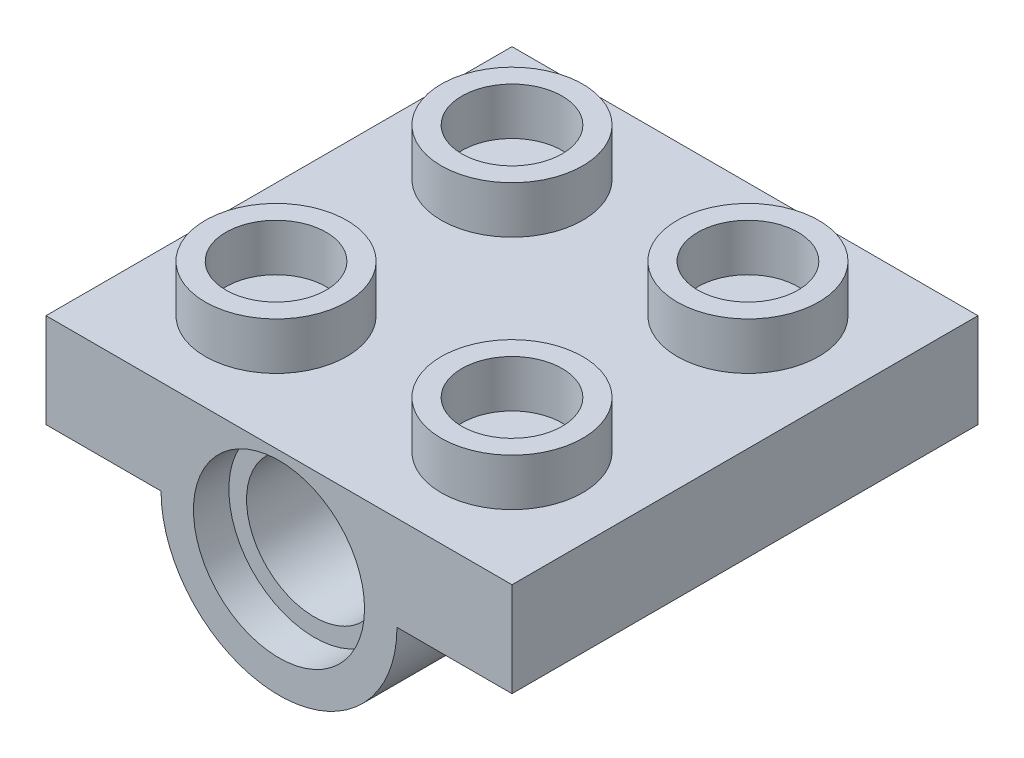
ISO-10303-21;
HEADER;
FILE_DESCRIPTION(('STEP AP214'),'2;1');
FILE_NAME('part.step','',(''),(''),'','','');
FILE_SCHEMA(('AUTOMOTIVE_DESIGN { 1 0 10303 214 1 1 1 1 }'));
ENDSEC;
DATA;
#1=APPLICATION_CONTEXT('core data for automotive mechanical design processes');
#2=APPLICATION_PROTOCOL_DEFINITION('international standard','automotive_design',2000,#1);
#3=PRODUCT_CONTEXT('',#1,'mechanical');
#4=PRODUCT('Part','Part','',(#3));
#5=PRODUCT_RELATED_PRODUCT_CATEGORY('part','',(#4));
#6=PRODUCT_DEFINITION_FORMATION('','',#4);
#7=PRODUCT_DEFINITION_CONTEXT('part definition',#1,'design');
#8=PRODUCT_DEFINITION('design','',#6,#7);
#9=PRODUCT_DEFINITION_SHAPE('','',#8);
#10=(LENGTH_UNIT() NAMED_UNIT(*) SI_UNIT(.MILLI.,.METRE.));
#11=(NAMED_UNIT(*) PLANE_ANGLE_UNIT() SI_UNIT($,.RADIAN.));
#12=(NAMED_UNIT(*) SI_UNIT($,.STERADIAN.) SOLID_ANGLE_UNIT());
#13=UNCERTAINTY_MEASURE_WITH_UNIT(LENGTH_MEASURE(1.E-05),#10,'distance_accuracy_value','');
#14=(GEOMETRIC_REPRESENTATION_CONTEXT(3) GLOBAL_UNCERTAINTY_ASSIGNED_CONTEXT((#13)) GLOBAL_UNIT_ASSIGNED_CONTEXT((#10,
#11,#12)) REPRESENTATION_CONTEXT('',''));
#15=CARTESIAN_POINT('',(0.,0.,0.));
#16=DIRECTION('',(0.,0.,1.));
#17=DIRECTION('',(1.,0.,0.));
#18=AXIS2_PLACEMENT_3D('',#15,#16,#17);
#19=CARTESIAN_POINT('',(0.,0.,-15.8));
#20=DIRECTION('',(0.,-1.,0.));
#21=DIRECTION('',(0.,0.,-1.));
#22=AXIS2_PLACEMENT_3D('',#19,#20,#21);
#23=PLANE('',#22);
#24=DIRECTION('',(1.,0.,0.));
#25=VECTOR('',#24,1.);
#26=CARTESIAN_POINT('',(14.6,0.,-14.6));
#27=LINE('',#26,#25);
#28=CARTESIAN_POINT('',(11.9,0.,-14.6));
#29=VERTEX_POINT('',#28);
#30=CARTESIAN_POINT('',(14.6,0.,-14.6));
#31=VERTEX_POINT('',#30);
#32=EDGE_CURVE('E278',#29,#31,#27,.T.);
#33=ORIENTED_EDGE('',*,*,#32,.F.);
#34=DIRECTION('',(0.,0.,-1.));
#35=VECTOR('',#34,1.);
#36=CARTESIAN_POINT('',(11.9,0.,-8.9));
#37=LINE('',#36,#35);
#38=CARTESIAN_POINT('',(11.9,0.,-15.8));
#39=VERTEX_POINT('',#38);
#40=EDGE_CURVE('E60',#29,#39,#37,.T.);
#41=ORIENTED_EDGE('',*,*,#40,.T.);
#42=DIRECTION('',(1.,0.,0.));
#43=VECTOR('',#42,1.);
#44=CARTESIAN_POINT('',(0.,0.,-15.8));
#45=LINE('',#44,#43);
#46=CARTESIAN_POINT('',(15.8,0.,-15.8));
#47=VERTEX_POINT('',#46);
#48=EDGE_CURVE('E382',#39,#47,#45,.T.);
#49=ORIENTED_EDGE('',*,*,#48,.T.);
#50=DIRECTION('',(0.,0.,1.));
#51=VECTOR('',#50,1.);
#52=CARTESIAN_POINT('',(15.8,0.,-15.8));
#53=LINE('',#52,#51);
#54=CARTESIAN_POINT('',(15.8,0.,0.));
#55=VERTEX_POINT('',#54);
#56=EDGE_CURVE('E416',#47,#55,#53,.T.);
#57=ORIENTED_EDGE('',*,*,#56,.T.);
#58=DIRECTION('',(1.,0.,0.));
#59=VECTOR('',#58,1.);
#60=CARTESIAN_POINT('',(0.,0.,0.));
#61=LINE('',#60,#59);
#62=CARTESIAN_POINT('',(11.9,0.,0.));
#63=VERTEX_POINT('',#62);
#64=EDGE_CURVE('E397',#63,#55,#61,.T.);
#65=ORIENTED_EDGE('',*,*,#64,.F.);
#66=DIRECTION('',(0.,0.,1.));
#67=VECTOR('',#66,1.);
#68=CARTESIAN_POINT('',(11.9,0.,-6.9));
#69=LINE('',#68,#67);
#70=CARTESIAN_POINT('',(11.9,0.,-1.2));
#71=VERTEX_POINT('',#70);
#72=EDGE_CURVE('E243',#71,#63,#69,.T.);
#73=ORIENTED_EDGE('',*,*,#72,.F.);
#74=DIRECTION('',(-1.,0.,0.));
#75=VECTOR('',#74,1.);
#76=CARTESIAN_POINT('',(1.2,0.,-1.2));
#77=LINE('',#76,#75);
#78=CARTESIAN_POINT('',(14.6,0.,-1.2));
#79=VERTEX_POINT('',#78);
#80=EDGE_CURVE('E265',#79,#71,#77,.T.);
#81=ORIENTED_EDGE('',*,*,#80,.F.);
#82=DIRECTION('',(0.,0.,1.));
#83=VECTOR('',#82,1.);
#84=CARTESIAN_POINT('',(14.6,0.,-1.2));
#85=LINE('',#84,#83);
#86=EDGE_CURVE('E271',#31,#79,#85,.T.);
#87=ORIENTED_EDGE('',*,*,#86,.F.);
#88=EDGE_LOOP('',(#33,#41,#49,#57,#65,#73,#81,#87));
#89=FACE_BOUND('',#88,.T.);
#90=ADVANCED_FACE('F43',(#89),#23,.T.);
#91=CARTESIAN_POINT('',(0.,0.,-15.8));
#92=VERTEX_POINT('',#91);
#93=CARTESIAN_POINT('',(3.9,0.,-15.8));
#94=VERTEX_POINT('',#93);
#95=EDGE_CURVE('E68',#92,#94,#45,.T.);
#96=ORIENTED_EDGE('',*,*,#95,.T.);
#97=DIRECTION('',(0.,0.,-1.));
#98=VECTOR('',#97,1.);
#99=CARTESIAN_POINT('',(3.9,0.,-8.9));
#100=LINE('',#99,#98);
#101=CARTESIAN_POINT('',(3.9,0.,-14.6));
#102=VERTEX_POINT('',#101);
#103=EDGE_CURVE('E191',#102,#94,#100,.T.);
#104=ORIENTED_EDGE('',*,*,#103,.F.);
#105=CARTESIAN_POINT('',(1.2,0.,-14.6));
#106=VERTEX_POINT('',#105);
#107=EDGE_CURVE('E275',#106,#102,#27,.T.);
#108=ORIENTED_EDGE('',*,*,#107,.F.);
#109=DIRECTION('',(0.,0.,-1.));
#110=VECTOR('',#109,1.);
#111=CARTESIAN_POINT('',(1.2,0.,-14.6));
#112=LINE('',#111,#110);
#113=CARTESIAN_POINT('',(1.2,0.,-1.2));
#114=VERTEX_POINT('',#113);
#115=EDGE_CURVE('E264',#114,#106,#112,.T.);
#116=ORIENTED_EDGE('',*,*,#115,.F.);
#117=CARTESIAN_POINT('',(3.9,0.,-1.2));
#118=VERTEX_POINT('',#117);
#119=EDGE_CURVE('E270',#118,#114,#77,.T.);
#120=ORIENTED_EDGE('',*,*,#119,.F.);
#121=DIRECTION('',(0.,0.,1.));
#122=VECTOR('',#121,1.);
#123=CARTESIAN_POINT('',(3.9,0.,-6.9));
#124=LINE('',#123,#122);
#125=CARTESIAN_POINT('',(3.9,0.,0.));
#126=VERTEX_POINT('',#125);
#127=EDGE_CURVE('E252',#118,#126,#124,.T.);
#128=ORIENTED_EDGE('',*,*,#127,.T.);
#129=CARTESIAN_POINT('',(0.,0.,0.));
#130=VERTEX_POINT('',#129);
#131=EDGE_CURVE('E398',#130,#126,#61,.T.);
#132=ORIENTED_EDGE('',*,*,#131,.F.);
#133=DIRECTION('',(0.,0.,1.));
#134=VECTOR('',#133,1.);
#135=CARTESIAN_POINT('',(0.,0.,-15.8));
#136=LINE('',#135,#134);
#137=EDGE_CURVE('E393',#92,#130,#136,.T.);
#138=ORIENTED_EDGE('',*,*,#137,.F.);
#139=EDGE_LOOP('',(#96,#104,#108,#116,#120,#128,#132,#138));
#140=FACE_BOUND('',#139,.T.);
#141=ADVANCED_FACE('F484',(#140),#23,.T.);
#142=CARTESIAN_POINT('',(0.,3.,-15.8));
#143=DIRECTION('',(0.,1.,0.));
#144=DIRECTION('',(0.,0.,1.));
#145=AXIS2_PLACEMENT_3D('',#142,#143,#144);
#146=PLANE('',#145);
#147=DIRECTION('',(0.,0.,1.));
#148=VECTOR('',#147,1.);
#149=CARTESIAN_POINT('',(11.9,3.,-15.8));
#150=LINE('',#149,#148);
#151=CARTESIAN_POINT('',(11.9,3.,-14.6));
#152=VERTEX_POINT('',#151);
#153=CARTESIAN_POINT('',(11.9,3.,-8.9));
#154=VERTEX_POINT('',#153);
#155=EDGE_CURVE('E214',#152,#154,#150,.T.);
#156=ORIENTED_EDGE('',*,*,#155,.F.);
#157=DIRECTION('',(1.,0.,0.));
#158=VECTOR('',#157,1.);
#159=CARTESIAN_POINT('',(14.6,3.,-14.6));
#160=LINE('',#159,#158);
#161=CARTESIAN_POINT('',(14.6,3.,-14.6));
#162=VERTEX_POINT('',#161);
#163=EDGE_CURVE('E269',#152,#162,#160,.T.);
#164=ORIENTED_EDGE('',*,*,#163,.T.);
#165=DIRECTION('',(0.,0.,1.));
#166=VECTOR('',#165,1.);
#167=CARTESIAN_POINT('',(14.6,3.,-1.2));
#168=LINE('',#167,#166);
#169=CARTESIAN_POINT('',(14.6,3.,-1.2));
#170=VERTEX_POINT('',#169);
#171=EDGE_CURVE('E298',#162,#170,#168,.T.);
#172=ORIENTED_EDGE('',*,*,#171,.T.);
#173=DIRECTION('',(-1.,0.,0.));
#174=VECTOR('',#173,1.);
#175=CARTESIAN_POINT('',(1.2,3.,-1.2));
#176=LINE('',#175,#174);
#177=CARTESIAN_POINT('',(11.9,3.,-1.2));
#178=VERTEX_POINT('',#177);
#179=EDGE_CURVE('E293',#170,#178,#176,.T.);
#180=ORIENTED_EDGE('',*,*,#179,.T.);
#181=DIRECTION('',(0.,0.,-1.));
#182=VECTOR('',#181,1.);
#183=CARTESIAN_POINT('',(11.9,3.,-15.8));
#184=LINE('',#183,#182);
#185=CARTESIAN_POINT('',(11.9,3.,-6.9));
#186=VERTEX_POINT('',#185);
#187=EDGE_CURVE('E251',#178,#186,#184,.T.);
#188=ORIENTED_EDGE('',*,*,#187,.T.);
#189=DIRECTION('',(-1.,0.,0.));
#190=VECTOR('',#189,1.);
#191=CARTESIAN_POINT('',(0.,3.,-6.9));
#192=LINE('',#191,#190);
#193=CARTESIAN_POINT('',(3.9,3.,-6.9));
#194=VERTEX_POINT('',#193);
#195=EDGE_CURVE('E429',#186,#194,#192,.T.);
#196=ORIENTED_EDGE('',*,*,#195,.T.);
#197=DIRECTION('',(0.,0.,1.));
#198=VECTOR('',#197,1.);
#199=CARTESIAN_POINT('',(3.9,3.,-15.8));
#200=LINE('',#199,#198);
#201=CARTESIAN_POINT('',(3.9,3.,-1.2));
#202=VERTEX_POINT('',#201);
#203=EDGE_CURVE('E260',#194,#202,#200,.T.);
#204=ORIENTED_EDGE('',*,*,#203,.T.);
#205=CARTESIAN_POINT('',(1.2,3.,-1.2));
#206=VERTEX_POINT('',#205);
#207=EDGE_CURVE('E297',#202,#206,#176,.T.);
#208=ORIENTED_EDGE('',*,*,#207,.T.);
#209=DIRECTION('',(0.,0.,-1.));
#210=VECTOR('',#209,1.);
#211=CARTESIAN_POINT('',(1.2,3.,-14.6));
#212=LINE('',#211,#210);
#213=CARTESIAN_POINT('',(1.2,3.,-14.6));
#214=VERTEX_POINT('',#213);
#215=EDGE_CURVE('E287',#206,#214,#212,.T.);
#216=ORIENTED_EDGE('',*,*,#215,.T.);
#217=CARTESIAN_POINT('',(3.9,3.,-14.6));
#218=VERTEX_POINT('',#217);
#219=EDGE_CURVE('E282',#214,#218,#160,.T.);
#220=ORIENTED_EDGE('',*,*,#219,.T.);
#221=DIRECTION('',(0.,0.,-1.));
#222=VECTOR('',#221,1.);
#223=CARTESIAN_POINT('',(3.9,3.,-15.8));
#224=LINE('',#223,#222);
#225=CARTESIAN_POINT('',(3.9,3.,-8.9));
#226=VERTEX_POINT('',#225);
#227=EDGE_CURVE('E210',#226,#218,#224,.T.);
#228=ORIENTED_EDGE('',*,*,#227,.F.);
#229=DIRECTION('',(1.,0.,0.));
#230=VECTOR('',#229,1.);
#231=CARTESIAN_POINT('',(0.,3.,-8.9));
#232=LINE('',#231,#230);
#233=EDGE_CURVE('E12',#226,#154,#232,.T.);
#234=ORIENTED_EDGE('',*,*,#233,.T.);
#235=EDGE_LOOP('',(#156,#164,#172,#180,#188,#196,#204,#208,#216,#220,#228,#234));
#236=FACE_BOUND('',#235,.T.);
#237=ADVANCED_FACE('F498',(#236),#146,.F.);
#238=CARTESIAN_POINT('',(14.6,22.1504617357995,-14.6));
#239=DIRECTION('',(0.,0.,-1.));
#240=DIRECTION('',(-1.,0.,0.));
#241=AXIS2_PLACEMENT_3D('',#238,#239,#240);
#242=PLANE('',#241);
#243=DIRECTION('',(0.,1.,0.));
#244=VECTOR('',#243,1.);
#245=CARTESIAN_POINT('',(11.9,22.1504617357995,-14.6));
#246=LINE('',#245,#244);
#247=EDGE_CURVE('E53',#29,#152,#246,.T.);
#248=ORIENTED_EDGE('',*,*,#247,.F.);
#249=ORIENTED_EDGE('',*,*,#32,.T.);
#250=DIRECTION('',(0.,-1.,0.));
#251=VECTOR('',#250,1.);
#252=CARTESIAN_POINT('',(14.6,22.1504617357995,-14.6));
#253=LINE('',#252,#251);
#254=EDGE_CURVE('E286',#162,#31,#253,.T.);
#255=ORIENTED_EDGE('',*,*,#254,.F.);
#256=ORIENTED_EDGE('',*,*,#163,.F.);
#257=EDGE_LOOP('',(#248,#249,#255,#256));
#258=FACE_BOUND('',#257,.T.);
#259=ADVANCED_FACE('F444',(#258),#242,.F.);
#260=DIRECTION('',(0.,-1.,0.));
#261=VECTOR('',#260,1.);
#262=CARTESIAN_POINT('',(3.9,22.1504617357995,-14.6));
#263=LINE('',#262,#261);
#264=EDGE_CURVE('E188',#218,#102,#263,.T.);
#265=ORIENTED_EDGE('',*,*,#264,.F.);
#266=ORIENTED_EDGE('',*,*,#219,.F.);
#267=DIRECTION('',(0.,-1.,0.));
#268=VECTOR('',#267,1.);
#269=CARTESIAN_POINT('',(1.2,22.1504617357995,-14.6));
#270=LINE('',#269,#268);
#271=EDGE_CURVE('E291',#214,#106,#270,.T.);
#272=ORIENTED_EDGE('',*,*,#271,.T.);
#273=ORIENTED_EDGE('',*,*,#107,.T.);
#274=EDGE_LOOP('',(#265,#266,#272,#273));
#275=FACE_BOUND('',#274,.T.);
#276=ADVANCED_FACE('F503',(#275),#242,.F.);
#277=CARTESIAN_POINT('',(1.2,22.1504617357995,-1.2));
#278=DIRECTION('',(0.,0.,1.));
#279=DIRECTION('',(1.,0.,0.));
#280=AXIS2_PLACEMENT_3D('',#277,#278,#279);
#281=PLANE('',#280);
#282=ORIENTED_EDGE('',*,*,#207,.F.);
#283=DIRECTION('',(0.,-1.,0.));
#284=VECTOR('',#283,1.);
#285=CARTESIAN_POINT('',(3.9,22.1504617357995,-1.2));
#286=LINE('',#285,#284);
#287=EDGE_CURVE('E425',#202,#118,#286,.T.);
#288=ORIENTED_EDGE('',*,*,#287,.T.);
#289=ORIENTED_EDGE('',*,*,#119,.T.);
#290=DIRECTION('',(0.,-1.,0.));
#291=VECTOR('',#290,1.);
#292=CARTESIAN_POINT('',(1.2,22.1504617357995,-1.2));
#293=LINE('',#292,#291);
#294=EDGE_CURVE('E292',#206,#114,#293,.T.);
#295=ORIENTED_EDGE('',*,*,#294,.F.);
#296=EDGE_LOOP('',(#282,#288,#289,#295));
#297=FACE_BOUND('',#296,.T.);
#298=ADVANCED_FACE('F494',(#297),#281,.F.);
#299=CARTESIAN_POINT('',(0.,0.,-15.8));
#300=DIRECTION('',(-1.,0.,0.));
#301=DIRECTION('',(0.,0.,1.));
#302=AXIS2_PLACEMENT_3D('',#299,#300,#301);
#303=PLANE('',#302);
#304=DIRECTION('',(0.,-1.,0.));
#305=VECTOR('',#304,1.);
#306=CARTESIAN_POINT('',(0.,0.,0.));
#307=LINE('',#306,#305);
#308=CARTESIAN_POINT('',(0.,3.2,0.));
#309=VERTEX_POINT('',#308);
#310=EDGE_CURVE('E374',#309,#130,#307,.T.);
#311=ORIENTED_EDGE('',*,*,#310,.F.);
#312=DIRECTION('',(0.,0.,1.));
#313=VECTOR('',#312,1.);
#314=CARTESIAN_POINT('',(0.,3.2,-15.8));
#315=LINE('',#314,#313);
#316=CARTESIAN_POINT('',(0.,3.2,-15.8));
#317=VERTEX_POINT('',#316);
#318=EDGE_CURVE('E408',#317,#309,#315,.T.);
#319=ORIENTED_EDGE('',*,*,#318,.F.);
#320=DIRECTION('',(0.,-1.,0.));
#321=VECTOR('',#320,1.);
#322=CARTESIAN_POINT('',(0.,0.,-15.8));
#323=LINE('',#322,#321);
#324=EDGE_CURVE('E378',#317,#92,#323,.T.);
#325=ORIENTED_EDGE('',*,*,#324,.T.);
#326=ORIENTED_EDGE('',*,*,#137,.T.);
#327=EDGE_LOOP('',(#311,#319,#325,#326));
#328=FACE_BOUND('',#327,.T.);
#329=ADVANCED_FACE('F45',(#328),#303,.T.);
#330=CARTESIAN_POINT('',(0.,3.2,-15.8));
#331=DIRECTION('',(0.,1.,0.));
#332=DIRECTION('',(0.,0.,1.));
#333=AXIS2_PLACEMENT_3D('',#330,#331,#332);
#334=PLANE('',#333);
#335=CARTESIAN_POINT('',(11.9,3.2,-11.9));
#336=DIRECTION('',(0.,1.,0.));
#337=DIRECTION('',(0.,0.,1.));
#338=AXIS2_PLACEMENT_3D('',#335,#336,#337);
#339=CIRCLE('',#338,2.4);
#340=CARTESIAN_POINT('',(11.9,3.2,-9.5));
#341=VERTEX_POINT('',#340);
#342=EDGE_CURVE('E323',#341,#341,#339,.T.);
#343=ORIENTED_EDGE('',*,*,#342,.F.);
#344=EDGE_LOOP('',(#343));
#345=FACE_BOUND('',#344,.T.);
#346=CARTESIAN_POINT('',(3.9,3.2,-11.9));
#347=DIRECTION('',(0.,1.,0.));
#348=DIRECTION('',(0.,0.,1.));
#349=AXIS2_PLACEMENT_3D('',#346,#347,#348);
#350=CIRCLE('',#349,2.4);
#351=CARTESIAN_POINT('',(3.9,3.2,-9.5));
#352=VERTEX_POINT('',#351);
#353=EDGE_CURVE('E342',#352,#352,#350,.T.);
#354=ORIENTED_EDGE('',*,*,#353,.F.);
#355=EDGE_LOOP('',(#354));
#356=FACE_BOUND('',#355,.T.);
#357=DIRECTION('',(-1.,0.,0.));
#358=VECTOR('',#357,1.);
#359=CARTESIAN_POINT('',(0.,3.2,-15.8));
#360=LINE('',#359,#358);
#361=CARTESIAN_POINT('',(15.8,3.2,-15.8));
#362=VERTEX_POINT('',#361);
#363=EDGE_CURVE('E390',#362,#317,#360,.T.);
#364=ORIENTED_EDGE('',*,*,#363,.T.);
#365=ORIENTED_EDGE('',*,*,#318,.T.);
#366=DIRECTION('',(-1.,0.,0.));
#367=VECTOR('',#366,1.);
#368=CARTESIAN_POINT('',(0.,3.2,0.));
#369=LINE('',#368,#367);
#370=CARTESIAN_POINT('',(15.8,3.2,0.));
#371=VERTEX_POINT('',#370);
#372=EDGE_CURVE('E383',#371,#309,#369,.T.);
#373=ORIENTED_EDGE('',*,*,#372,.F.);
#374=DIRECTION('',(0.,0.,1.));
#375=VECTOR('',#374,1.);
#376=CARTESIAN_POINT('',(15.8,3.2,-15.8));
#377=LINE('',#376,#375);
#378=EDGE_CURVE('E413',#362,#371,#377,.T.);
#379=ORIENTED_EDGE('',*,*,#378,.F.);
#380=EDGE_LOOP('',(#364,#365,#373,#379));
#381=FACE_BOUND('',#380,.T.);
#382=CARTESIAN_POINT('',(3.9,3.2,-3.9));
#383=DIRECTION('',(0.,1.,0.));
#384=DIRECTION('',(0.,0.,1.));
#385=AXIS2_PLACEMENT_3D('',#382,#383,#384);
#386=CIRCLE('',#385,2.4);
#387=CARTESIAN_POINT('',(3.9,3.2,-1.5));
#388=VERTEX_POINT('',#387);
#389=EDGE_CURVE('E369',#388,#388,#386,.T.);
#390=ORIENTED_EDGE('',*,*,#389,.F.);
#391=EDGE_LOOP('',(#390));
#392=FACE_BOUND('',#391,.T.);
#393=CARTESIAN_POINT('',(11.9,3.2,-3.9));
#394=DIRECTION('',(0.,1.,0.));
#395=DIRECTION('',(0.,0.,1.));
#396=AXIS2_PLACEMENT_3D('',#393,#394,#395);
#397=CIRCLE('',#396,2.4);
#398=CARTESIAN_POINT('',(11.9,3.2,-1.5));
#399=VERTEX_POINT('',#398);
#400=EDGE_CURVE('E350',#399,#399,#397,.T.);
#401=ORIENTED_EDGE('',*,*,#400,.F.);
#402=EDGE_LOOP('',(#401));
#403=FACE_BOUND('',#402,.T.);
#404=ADVANCED_FACE('F479',(#345,#356,#381,#392,#403),#334,.T.);
#405=CARTESIAN_POINT('',(15.8,0.,-15.8));
#406=DIRECTION('',(1.,0.,0.));
#407=DIRECTION('',(0.,0.,-1.));
#408=AXIS2_PLACEMENT_3D('',#405,#406,#407);
#409=PLANE('',#408);
#410=DIRECTION('',(0.,1.,0.));
#411=VECTOR('',#410,1.);
#412=CARTESIAN_POINT('',(15.8,0.,0.));
#413=LINE('',#412,#411);
#414=EDGE_CURVE('E402',#55,#371,#413,.T.);
#415=ORIENTED_EDGE('',*,*,#414,.F.);
#416=ORIENTED_EDGE('',*,*,#56,.F.);
#417=DIRECTION('',(0.,1.,0.));
#418=VECTOR('',#417,1.);
#419=CARTESIAN_POINT('',(15.8,0.,-15.8));
#420=LINE('',#419,#418);
#421=EDGE_CURVE('E386',#47,#362,#420,.T.);
#422=ORIENTED_EDGE('',*,*,#421,.T.);
#423=ORIENTED_EDGE('',*,*,#378,.T.);
#424=EDGE_LOOP('',(#415,#416,#422,#423));
#425=FACE_BOUND('',#424,.T.);
#426=ADVANCED_FACE('F476',(#425),#409,.T.);
#427=CARTESIAN_POINT('',(0.,0.,-15.8));
#428=DIRECTION('',(0.,0.,-1.));
#429=DIRECTION('',(-1.,0.,0.));
#430=AXIS2_PLACEMENT_3D('',#427,#428,#429);
#431=PLANE('',#430);
#432=CARTESIAN_POINT('',(7.9,0.,-15.8));
#433=DIRECTION('',(0.,0.,1.));
#434=DIRECTION('',(1.,0.,0.));
#435=AXIS2_PLACEMENT_3D('',#432,#433,#434);
#436=CIRCLE('',#435,2.9);
#437=CARTESIAN_POINT('',(10.8,0.,-15.8));
#438=VERTEX_POINT('',#437);
#439=EDGE_CURVE('E204',#438,#438,#436,.T.);
#440=ORIENTED_EDGE('',*,*,#439,.T.);
#441=EDGE_LOOP('',(#440));
#442=FACE_BOUND('',#441,.T.);
#443=ORIENTED_EDGE('',*,*,#324,.F.);
#444=ORIENTED_EDGE('',*,*,#363,.F.);
#445=ORIENTED_EDGE('',*,*,#421,.F.);
#446=ORIENTED_EDGE('',*,*,#48,.F.);
#447=CARTESIAN_POINT('',(7.9,0.,-15.8));
#448=DIRECTION('',(0.,0.,1.));
#449=DIRECTION('',(-1.,0.,0.));
#450=AXIS2_PLACEMENT_3D('',#447,#448,#449);
#451=CIRCLE('',#450,4.);
#452=EDGE_CURVE('E198',#94,#39,#451,.T.);
#453=ORIENTED_EDGE('',*,*,#452,.F.);
#454=ORIENTED_EDGE('',*,*,#95,.F.);
#455=EDGE_LOOP('',(#443,#444,#445,#446,#453,#454));
#456=FACE_BOUND('',#455,.T.);
#457=ADVANCED_FACE('F455',(#442,#456),#431,.T.);
#458=CARTESIAN_POINT('',(0.,0.,0.));
#459=DIRECTION('',(0.,0.,-1.));
#460=DIRECTION('',(-1.,0.,0.));
#461=AXIS2_PLACEMENT_3D('',#458,#459,#460);
#462=PLANE('',#461);
#463=CARTESIAN_POINT('',(7.9,0.,0.));
#464=DIRECTION('',(0.,0.,1.));
#465=DIRECTION('',(1.,0.,0.));
#466=AXIS2_PLACEMENT_3D('',#463,#464,#465);
#467=CIRCLE('',#466,2.9);
#468=CARTESIAN_POINT('',(10.8,0.,0.));
#469=VERTEX_POINT('',#468);
#470=EDGE_CURVE('E228',#469,#469,#467,.T.);
#471=ORIENTED_EDGE('',*,*,#470,.F.);
#472=EDGE_LOOP('',(#471));
#473=FACE_BOUND('',#472,.T.);
#474=ORIENTED_EDGE('',*,*,#372,.T.);
#475=ORIENTED_EDGE('',*,*,#310,.T.);
#476=ORIENTED_EDGE('',*,*,#131,.T.);
#477=CARTESIAN_POINT('',(7.9,0.,0.));
#478=DIRECTION('',(0.,0.,1.));
#479=DIRECTION('',(-1.,0.,0.));
#480=AXIS2_PLACEMENT_3D('',#477,#478,#479);
#481=CIRCLE('',#480,4.);
#482=EDGE_CURVE('E227',#126,#63,#481,.T.);
#483=ORIENTED_EDGE('',*,*,#482,.T.);
#484=ORIENTED_EDGE('',*,*,#64,.T.);
#485=ORIENTED_EDGE('',*,*,#414,.T.);
#486=EDGE_LOOP('',(#474,#475,#476,#483,#484,#485));
#487=FACE_BOUND('',#486,.T.);
#488=ADVANCED_FACE('F472',(#473,#487),#462,.F.);
#489=CARTESIAN_POINT('',(3.9,4.8,-3.9));
#490=DIRECTION('',(0.,-1.,0.));
#491=DIRECTION('',(0.,0.,-1.));
#492=AXIS2_PLACEMENT_3D('',#489,#490,#491);
#493=CYLINDRICAL_SURFACE('',#492,2.4);
#494=CARTESIAN_POINT('',(3.9,4.8,-3.9));
#495=DIRECTION('',(0.,1.,0.));
#496=DIRECTION('',(0.,0.,1.));
#497=AXIS2_PLACEMENT_3D('',#494,#495,#496);
#498=CIRCLE('',#497,2.4);
#499=CARTESIAN_POINT('',(3.9,4.8,-1.5));
#500=VERTEX_POINT('',#499);
#501=EDGE_CURVE('E370',#500,#500,#498,.T.);
#502=ORIENTED_EDGE('',*,*,#501,.F.);
#503=EDGE_LOOP('',(#502));
#504=FACE_BOUND('',#503,.T.);
#505=ORIENTED_EDGE('',*,*,#389,.T.);
#506=EDGE_LOOP('',(#505));
#507=FACE_BOUND('',#506,.T.);
#508=ADVANCED_FACE('F537',(#504,#507),#493,.T.);
#509=CARTESIAN_POINT('',(3.9,4.8,-3.9));
#510=DIRECTION('',(0.,1.,0.));
#511=DIRECTION('',(0.,0.,1.));
#512=AXIS2_PLACEMENT_3D('',#509,#510,#511);
#513=PLANE('',#512);
#514=CARTESIAN_POINT('',(3.9,4.8,-3.9));
#515=DIRECTION('',(0.,1.,0.));
#516=DIRECTION('',(0.,0.,1.));
#517=AXIS2_PLACEMENT_3D('',#514,#515,#516);
#518=CIRCLE('',#517,1.7);
#519=CARTESIAN_POINT('',(3.9,4.8,-2.2));
#520=VERTEX_POINT('',#519);
#521=EDGE_CURVE('E358',#520,#520,#518,.T.);
#522=ORIENTED_EDGE('',*,*,#521,.F.);
#523=EDGE_LOOP('',(#522));
#524=FACE_BOUND('',#523,.T.);
#525=ORIENTED_EDGE('',*,*,#501,.T.);
#526=EDGE_LOOP('',(#525));
#527=FACE_BOUND('',#526,.T.);
#528=ADVANCED_FACE('F544',(#524,#527),#513,.T.);
#529=CARTESIAN_POINT('',(3.9,-1.60832611206852,-3.9));
#530=DIRECTION('',(0.,1.,0.));
#531=DIRECTION('',(0.,0.,1.));
#532=AXIS2_PLACEMENT_3D('',#529,#530,#531);
#533=CYLINDRICAL_SURFACE('',#532,1.7);
#534=CARTESIAN_POINT('',(3.9,3.2,-3.9));
#535=DIRECTION('',(0.,1.,0.));
#536=DIRECTION('',(0.,0.,1.));
#537=AXIS2_PLACEMENT_3D('',#534,#535,#536);
#538=CIRCLE('',#537,1.7);
#539=CARTESIAN_POINT('',(3.9,3.2,-2.2));
#540=VERTEX_POINT('',#539);
#541=EDGE_CURVE('E365',#540,#540,#538,.F.);
#542=ORIENTED_EDGE('',*,*,#541,.T.);
#543=EDGE_LOOP('',(#542));
#544=FACE_BOUND('',#543,.T.);
#545=ORIENTED_EDGE('',*,*,#521,.T.);
#546=EDGE_LOOP('',(#545));
#547=FACE_BOUND('',#546,.T.);
#548=ADVANCED_FACE('F548',(#544,#547),#533,.F.);
#549=CARTESIAN_POINT('',(0.,3.2,-15.8));
#550=DIRECTION('',(0.,1.,0.));
#551=DIRECTION('',(0.,0.,1.));
#552=AXIS2_PLACEMENT_3D('',#549,#550,#551);
#553=PLANE('',#552);
#554=ORIENTED_EDGE('',*,*,#541,.F.);
#555=EDGE_LOOP('',(#554));
#556=FACE_BOUND('',#555,.T.);
#557=ADVANCED_FACE('F552',(#556),#553,.T.);
#558=CARTESIAN_POINT('',(11.9,4.8,-3.9));
#559=DIRECTION('',(0.,-1.,0.));
#560=DIRECTION('',(0.,0.,-1.));
#561=AXIS2_PLACEMENT_3D('',#558,#559,#560);
#562=CYLINDRICAL_SURFACE('',#561,2.4);
#563=CARTESIAN_POINT('',(11.9,4.8,-3.9));
#564=DIRECTION('',(0.,1.,0.));
#565=DIRECTION('',(0.,0.,1.));
#566=AXIS2_PLACEMENT_3D('',#563,#564,#565);
#567=CIRCLE('',#566,2.4);
#568=CARTESIAN_POINT('',(11.9,4.8,-1.5));
#569=VERTEX_POINT('',#568);
#570=EDGE_CURVE('E354',#569,#569,#567,.T.);
#571=ORIENTED_EDGE('',*,*,#570,.F.);
#572=EDGE_LOOP('',(#571));
#573=FACE_BOUND('',#572,.T.);
#574=ORIENTED_EDGE('',*,*,#400,.T.);
#575=EDGE_LOOP('',(#574));
#576=FACE_BOUND('',#575,.T.);
#577=ADVANCED_FACE('F556',(#573,#576),#562,.T.);
#578=CARTESIAN_POINT('',(11.9,4.8,-3.9));
#579=DIRECTION('',(0.,1.,0.));
#580=DIRECTION('',(0.,0.,1.));
#581=AXIS2_PLACEMENT_3D('',#578,#579,#580);
#582=PLANE('',#581);
#583=CARTESIAN_POINT('',(11.9,4.8,-3.9));
#584=DIRECTION('',(0.,1.,0.));
#585=DIRECTION('',(0.,0.,1.));
#586=AXIS2_PLACEMENT_3D('',#583,#584,#585);
#587=CIRCLE('',#586,1.7);
#588=CARTESIAN_POINT('',(11.9,4.8,-2.2));
#589=VERTEX_POINT('',#588);
#590=EDGE_CURVE('E314',#589,#589,#587,.T.);
#591=ORIENTED_EDGE('',*,*,#590,.F.);
#592=EDGE_LOOP('',(#591));
#593=FACE_BOUND('',#592,.T.);
#594=ORIENTED_EDGE('',*,*,#570,.T.);
#595=EDGE_LOOP('',(#594));
#596=FACE_BOUND('',#595,.T.);
#597=ADVANCED_FACE('F560',(#593,#596),#582,.T.);
#598=CARTESIAN_POINT('',(3.9,4.8,-11.9));
#599=DIRECTION('',(0.,-1.,0.));
#600=DIRECTION('',(0.,0.,-1.));
#601=AXIS2_PLACEMENT_3D('',#598,#599,#600);
#602=CYLINDRICAL_SURFACE('',#601,2.4);
#603=CARTESIAN_POINT('',(3.9,4.8,-11.9));
#604=DIRECTION('',(0.,1.,0.));
#605=DIRECTION('',(0.,0.,1.));
#606=AXIS2_PLACEMENT_3D('',#603,#604,#605);
#607=CIRCLE('',#606,2.4);
#608=CARTESIAN_POINT('',(3.9,4.8,-9.5));
#609=VERTEX_POINT('',#608);
#610=EDGE_CURVE('E346',#609,#609,#607,.T.);
#611=ORIENTED_EDGE('',*,*,#610,.F.);
#612=EDGE_LOOP('',(#611));
#613=FACE_BOUND('',#612,.T.);
#614=ORIENTED_EDGE('',*,*,#353,.T.);
#615=EDGE_LOOP('',(#614));
#616=FACE_BOUND('',#615,.T.);
#617=ADVANCED_FACE('F564',(#613,#616),#602,.T.);
#618=CARTESIAN_POINT('',(3.9,4.8,-11.9));
#619=DIRECTION('',(0.,1.,0.));
#620=DIRECTION('',(0.,0.,1.));
#621=AXIS2_PLACEMENT_3D('',#618,#619,#620);
#622=PLANE('',#621);
#623=CARTESIAN_POINT('',(3.9,4.8,-11.9));
#624=DIRECTION('',(0.,1.,0.));
#625=DIRECTION('',(0.,0.,1.));
#626=AXIS2_PLACEMENT_3D('',#623,#624,#625);
#627=CIRCLE('',#626,1.7);
#628=CARTESIAN_POINT('',(3.9,4.8,-10.2));
#629=VERTEX_POINT('',#628);
#630=EDGE_CURVE('E324',#629,#629,#627,.T.);
#631=ORIENTED_EDGE('',*,*,#630,.F.);
#632=EDGE_LOOP('',(#631));
#633=FACE_BOUND('',#632,.T.);
#634=ORIENTED_EDGE('',*,*,#610,.T.);
#635=EDGE_LOOP('',(#634));
#636=FACE_BOUND('',#635,.T.);
#637=ADVANCED_FACE('F568',(#633,#636),#622,.T.);
#638=CARTESIAN_POINT('',(11.9,4.8,-11.9));
#639=DIRECTION('',(0.,-1.,0.));
#640=DIRECTION('',(0.,0.,-1.));
#641=AXIS2_PLACEMENT_3D('',#638,#639,#640);
#642=CYLINDRICAL_SURFACE('',#641,2.4);
#643=CARTESIAN_POINT('',(11.9,4.8,-11.9));
#644=DIRECTION('',(0.,1.,0.));
#645=DIRECTION('',(0.,0.,1.));
#646=AXIS2_PLACEMENT_3D('',#643,#644,#645);
#647=CIRCLE('',#646,2.4);
#648=CARTESIAN_POINT('',(11.9,4.8,-9.5));
#649=VERTEX_POINT('',#648);
#650=EDGE_CURVE('E338',#649,#649,#647,.T.);
#651=ORIENTED_EDGE('',*,*,#650,.F.);
#652=EDGE_LOOP('',(#651));
#653=FACE_BOUND('',#652,.T.);
#654=ORIENTED_EDGE('',*,*,#342,.T.);
#655=EDGE_LOOP('',(#654));
#656=FACE_BOUND('',#655,.T.);
#657=ADVANCED_FACE('F572',(#653,#656),#642,.T.);
#658=CARTESIAN_POINT('',(11.9,4.8,-11.9));
#659=DIRECTION('',(0.,1.,0.));
#660=DIRECTION('',(0.,0.,1.));
#661=AXIS2_PLACEMENT_3D('',#658,#659,#660);
#662=PLANE('',#661);
#663=CARTESIAN_POINT('',(11.9,4.8,-11.9));
#664=DIRECTION('',(0.,1.,0.));
#665=DIRECTION('',(0.,0.,1.));
#666=AXIS2_PLACEMENT_3D('',#663,#664,#665);
#667=CIRCLE('',#666,1.7);
#668=CARTESIAN_POINT('',(11.9,4.8,-10.2));
#669=VERTEX_POINT('',#668);
#670=EDGE_CURVE('E313',#669,#669,#667,.T.);
#671=ORIENTED_EDGE('',*,*,#670,.F.);
#672=EDGE_LOOP('',(#671));
#673=FACE_BOUND('',#672,.T.);
#674=ORIENTED_EDGE('',*,*,#650,.T.);
#675=EDGE_LOOP('',(#674));
#676=FACE_BOUND('',#675,.T.);
#677=ADVANCED_FACE('F576',(#673,#676),#662,.T.);
#678=CARTESIAN_POINT('',(11.9,-1.60832611206852,-11.9));
#679=DIRECTION('',(0.,1.,0.));
#680=DIRECTION('',(0.,0.,1.));
#681=AXIS2_PLACEMENT_3D('',#678,#679,#680);
#682=CYLINDRICAL_SURFACE('',#681,1.7);
#683=CARTESIAN_POINT('',(11.9,3.2,-11.9));
#684=DIRECTION('',(0.,1.,0.));
#685=DIRECTION('',(0.,0.,1.));
#686=AXIS2_PLACEMENT_3D('',#683,#684,#685);
#687=CIRCLE('',#686,1.7);
#688=CARTESIAN_POINT('',(11.9,3.2,-10.2));
#689=VERTEX_POINT('',#688);
#690=EDGE_CURVE('E328',#689,#689,#687,.F.);
#691=ORIENTED_EDGE('',*,*,#690,.T.);
#692=EDGE_LOOP('',(#691));
#693=FACE_BOUND('',#692,.T.);
#694=ORIENTED_EDGE('',*,*,#670,.T.);
#695=EDGE_LOOP('',(#694));
#696=FACE_BOUND('',#695,.T.);
#697=ADVANCED_FACE('F580',(#693,#696),#682,.F.);
#698=CARTESIAN_POINT('',(0.,3.2,-15.8));
#699=DIRECTION('',(0.,1.,0.));
#700=DIRECTION('',(0.,0.,1.));
#701=AXIS2_PLACEMENT_3D('',#698,#699,#700);
#702=PLANE('',#701);
#703=ORIENTED_EDGE('',*,*,#690,.F.);
#704=EDGE_LOOP('',(#703));
#705=FACE_BOUND('',#704,.T.);
#706=ADVANCED_FACE('F584',(#705),#702,.T.);
#707=CARTESIAN_POINT('',(3.9,-1.60832611206852,-11.9));
#708=DIRECTION('',(0.,1.,0.));
#709=DIRECTION('',(0.,0.,1.));
#710=AXIS2_PLACEMENT_3D('',#707,#708,#709);
#711=CYLINDRICAL_SURFACE('',#710,1.7);
#712=CARTESIAN_POINT('',(3.9,3.2,-11.9));
#713=DIRECTION('',(0.,1.,0.));
#714=DIRECTION('',(0.,0.,1.));
#715=AXIS2_PLACEMENT_3D('',#712,#713,#714);
#716=CIRCLE('',#715,1.7);
#717=CARTESIAN_POINT('',(3.9,3.2,-10.2));
#718=VERTEX_POINT('',#717);
#719=EDGE_CURVE('E319',#718,#718,#716,.F.);
#720=ORIENTED_EDGE('',*,*,#719,.T.);
#721=EDGE_LOOP('',(#720));
#722=FACE_BOUND('',#721,.T.);
#723=ORIENTED_EDGE('',*,*,#630,.T.);
#724=EDGE_LOOP('',(#723));
#725=FACE_BOUND('',#724,.T.);
#726=ADVANCED_FACE('F588',(#722,#725),#711,.F.);
#727=CARTESIAN_POINT('',(0.,3.2,-15.8));
#728=DIRECTION('',(0.,1.,0.));
#729=DIRECTION('',(0.,0.,1.));
#730=AXIS2_PLACEMENT_3D('',#727,#728,#729);
#731=PLANE('',#730);
#732=ORIENTED_EDGE('',*,*,#719,.F.);
#733=EDGE_LOOP('',(#732));
#734=FACE_BOUND('',#733,.T.);
#735=ADVANCED_FACE('F592',(#734),#731,.T.);
#736=CARTESIAN_POINT('',(11.9,-1.60832611206852,-3.9));
#737=DIRECTION('',(0.,1.,0.));
#738=DIRECTION('',(0.,0.,1.));
#739=AXIS2_PLACEMENT_3D('',#736,#737,#738);
#740=CYLINDRICAL_SURFACE('',#739,1.7);
#741=CARTESIAN_POINT('',(11.9,3.2,-3.9));
#742=DIRECTION('',(0.,1.,0.));
#743=DIRECTION('',(0.,0.,1.));
#744=AXIS2_PLACEMENT_3D('',#741,#742,#743);
#745=CIRCLE('',#744,1.7);
#746=CARTESIAN_POINT('',(11.9,3.2,-2.2));
#747=VERTEX_POINT('',#746);
#748=EDGE_CURVE('E318',#747,#747,#745,.F.);
#749=ORIENTED_EDGE('',*,*,#748,.T.);
#750=EDGE_LOOP('',(#749));
#751=FACE_BOUND('',#750,.T.);
#752=ORIENTED_EDGE('',*,*,#590,.T.);
#753=EDGE_LOOP('',(#752));
#754=FACE_BOUND('',#753,.T.);
#755=ADVANCED_FACE('F596',(#751,#754),#740,.F.);
#756=CARTESIAN_POINT('',(0.,3.2,-15.8));
#757=DIRECTION('',(0.,1.,0.));
#758=DIRECTION('',(0.,0.,1.));
#759=AXIS2_PLACEMENT_3D('',#756,#757,#758);
#760=PLANE('',#759);
#761=ORIENTED_EDGE('',*,*,#748,.F.);
#762=EDGE_LOOP('',(#761));
#763=FACE_BOUND('',#762,.T.);
#764=ADVANCED_FACE('F600',(#763),#760,.T.);
#765=CARTESIAN_POINT('',(14.6,22.1504617357995,-1.2));
#766=DIRECTION('',(1.,0.,0.));
#767=DIRECTION('',(0.,0.,-1.));
#768=AXIS2_PLACEMENT_3D('',#765,#766,#767);
#769=PLANE('',#768);
#770=ORIENTED_EDGE('',*,*,#254,.T.);
#771=ORIENTED_EDGE('',*,*,#86,.T.);
#772=DIRECTION('',(0.,-1.,0.));
#773=VECTOR('',#772,1.);
#774=CARTESIAN_POINT('',(14.6,22.1504617357995,-1.2));
#775=LINE('',#774,#773);
#776=EDGE_CURVE('E302',#170,#79,#775,.T.);
#777=ORIENTED_EDGE('',*,*,#776,.F.);
#778=ORIENTED_EDGE('',*,*,#171,.F.);
#779=EDGE_LOOP('',(#770,#771,#777,#778));
#780=FACE_BOUND('',#779,.T.);
#781=ADVANCED_FACE('F507',(#780),#769,.F.);
#782=ORIENTED_EDGE('',*,*,#80,.T.);
#783=DIRECTION('',(0.,1.,0.));
#784=VECTOR('',#783,1.);
#785=CARTESIAN_POINT('',(11.9,22.1504617357995,-1.2));
#786=LINE('',#785,#784);
#787=EDGE_CURVE('E412',#71,#178,#786,.T.);
#788=ORIENTED_EDGE('',*,*,#787,.T.);
#789=ORIENTED_EDGE('',*,*,#179,.F.);
#790=ORIENTED_EDGE('',*,*,#776,.T.);
#791=EDGE_LOOP('',(#782,#788,#789,#790));
#792=FACE_BOUND('',#791,.T.);
#793=ADVANCED_FACE('F509',(#792),#281,.F.);
#794=CARTESIAN_POINT('',(1.2,22.1504617357995,-14.6));
#795=DIRECTION('',(-1.,0.,0.));
#796=DIRECTION('',(0.,0.,1.));
#797=AXIS2_PLACEMENT_3D('',#794,#795,#796);
#798=PLANE('',#797);
#799=ORIENTED_EDGE('',*,*,#294,.T.);
#800=ORIENTED_EDGE('',*,*,#115,.T.);
#801=ORIENTED_EDGE('',*,*,#271,.F.);
#802=ORIENTED_EDGE('',*,*,#215,.F.);
#803=EDGE_LOOP('',(#799,#800,#801,#802));
#804=FACE_BOUND('',#803,.T.);
#805=ADVANCED_FACE('F501',(#804),#798,.F.);
#806=CARTESIAN_POINT('',(7.9,0.,-6.9));
#807=DIRECTION('',(0.,0.,-1.));
#808=DIRECTION('',(-1.,0.,0.));
#809=AXIS2_PLACEMENT_3D('',#806,#807,#808);
#810=PLANE('',#809);
#811=CARTESIAN_POINT('',(7.9,0.,-6.9));
#812=DIRECTION('',(0.,0.,-1.));
#813=DIRECTION('',(-1.,0.,0.));
#814=AXIS2_PLACEMENT_3D('',#811,#812,#813);
#815=CIRCLE('',#814,2.3);
#816=CARTESIAN_POINT('',(5.6,0.,-6.9));
#817=VERTEX_POINT('',#816);
#818=EDGE_CURVE('E218',#817,#817,#815,.F.);
#819=ORIENTED_EDGE('',*,*,#818,.T.);
#820=EDGE_LOOP('',(#819));
#821=FACE_BOUND('',#820,.T.);
#822=ORIENTED_EDGE('',*,*,#195,.F.);
#823=DIRECTION('',(0.,1.,0.));
#824=VECTOR('',#823,1.);
#825=CARTESIAN_POINT('',(11.9,0.,-6.9));
#826=LINE('',#825,#824);
#827=CARTESIAN_POINT('',(11.9,0.,-6.9));
#828=VERTEX_POINT('',#827);
#829=EDGE_CURVE('E236',#828,#186,#826,.T.);
#830=ORIENTED_EDGE('',*,*,#829,.F.);
#831=CARTESIAN_POINT('',(7.9,0.,-6.9));
#832=DIRECTION('',(0.,0.,1.));
#833=DIRECTION('',(-1.,0.,0.));
#834=AXIS2_PLACEMENT_3D('',#831,#832,#833);
#835=CIRCLE('',#834,4.);
#836=CARTESIAN_POINT('',(3.9,0.,-6.9));
#837=VERTEX_POINT('',#836);
#838=EDGE_CURVE('E232',#837,#828,#835,.T.);
#839=ORIENTED_EDGE('',*,*,#838,.F.);
#840=DIRECTION('',(0.,-1.,0.));
#841=VECTOR('',#840,1.);
#842=CARTESIAN_POINT('',(3.9,0.,-6.9));
#843=LINE('',#842,#841);
#844=EDGE_CURVE('E240',#194,#837,#843,.T.);
#845=ORIENTED_EDGE('',*,*,#844,.F.);
#846=EDGE_LOOP('',(#822,#830,#839,#845));
#847=FACE_BOUND('',#846,.T.);
#848=ADVANCED_FACE('F514',(#821,#847),#810,.T.);
#849=CARTESIAN_POINT('',(3.9,0.,-6.9));
#850=DIRECTION('',(-1.,0.,0.));
#851=DIRECTION('',(0.,-1.,0.));
#852=AXIS2_PLACEMENT_3D('',#849,#850,#851);
#853=PLANE('',#852);
#854=ORIENTED_EDGE('',*,*,#203,.F.);
#855=ORIENTED_EDGE('',*,*,#844,.T.);
#856=EDGE_CURVE('E247',#837,#118,#124,.T.);
#857=ORIENTED_EDGE('',*,*,#856,.T.);
#858=ORIENTED_EDGE('',*,*,#287,.F.);
#859=EDGE_LOOP('',(#854,#855,#857,#858));
#860=FACE_BOUND('',#859,.T.);
#861=ADVANCED_FACE('F490',(#860),#853,.T.);
#862=CARTESIAN_POINT('',(11.9,0.,-6.9));
#863=DIRECTION('',(1.,0.,0.));
#864=DIRECTION('',(0.,1.,0.));
#865=AXIS2_PLACEMENT_3D('',#862,#863,#864);
#866=PLANE('',#865);
#867=ORIENTED_EDGE('',*,*,#187,.F.);
#868=ORIENTED_EDGE('',*,*,#787,.F.);
#869=EDGE_CURVE('E253',#828,#71,#69,.T.);
#870=ORIENTED_EDGE('',*,*,#869,.F.);
#871=ORIENTED_EDGE('',*,*,#829,.T.);
#872=EDGE_LOOP('',(#867,#868,#870,#871));
#873=FACE_BOUND('',#872,.T.);
#874=ADVANCED_FACE('F511',(#873),#866,.T.);
#875=CARTESIAN_POINT('',(7.9,0.,-6.9));
#876=DIRECTION('',(0.,0.,1.));
#877=DIRECTION('',(1.,0.,0.));
#878=AXIS2_PLACEMENT_3D('',#875,#876,#877);
#879=CYLINDRICAL_SURFACE('',#878,4.);
#880=ORIENTED_EDGE('',*,*,#482,.F.);
#881=ORIENTED_EDGE('',*,*,#127,.F.);
#882=ORIENTED_EDGE('',*,*,#856,.F.);
#883=ORIENTED_EDGE('',*,*,#838,.T.);
#884=ORIENTED_EDGE('',*,*,#869,.T.);
#885=ORIENTED_EDGE('',*,*,#72,.T.);
#886=EDGE_LOOP('',(#880,#881,#882,#883,#884,#885));
#887=FACE_BOUND('',#886,.T.);
#888=ADVANCED_FACE('F469',(#887),#879,.T.);
#889=CARTESIAN_POINT('',(7.9,0.,-1.2));
#890=DIRECTION('',(0.,0.,1.));
#891=DIRECTION('',(1.,0.,0.));
#892=AXIS2_PLACEMENT_3D('',#889,#890,#891);
#893=CYLINDRICAL_SURFACE('',#892,2.9);
#894=CARTESIAN_POINT('',(7.9,0.,-1.2));
#895=DIRECTION('',(0.,0.,1.));
#896=DIRECTION('',(1.,0.,0.));
#897=AXIS2_PLACEMENT_3D('',#894,#895,#896);
#898=CIRCLE('',#897,2.9);
#899=CARTESIAN_POINT('',(10.8,0.,-1.2));
#900=VERTEX_POINT('',#899);
#901=EDGE_CURVE('E223',#900,#900,#898,.T.);
#902=ORIENTED_EDGE('',*,*,#901,.F.);
#903=EDGE_LOOP('',(#902));
#904=FACE_BOUND('',#903,.T.);
#905=ORIENTED_EDGE('',*,*,#470,.T.);
#906=EDGE_LOOP('',(#905));
#907=FACE_BOUND('',#906,.T.);
#908=ADVANCED_FACE('F615',(#904,#907),#893,.F.);
#909=CARTESIAN_POINT('',(7.9,0.,-1.2));
#910=DIRECTION('',(0.,0.,1.));
#911=DIRECTION('',(1.,0.,0.));
#912=AXIS2_PLACEMENT_3D('',#909,#910,#911);
#913=PLANE('',#912);
#914=CARTESIAN_POINT('',(7.9,0.,-1.2));
#915=DIRECTION('',(0.,0.,1.));
#916=DIRECTION('',(1.,0.,0.));
#917=AXIS2_PLACEMENT_3D('',#914,#915,#916);
#918=CIRCLE('',#917,2.3);
#919=CARTESIAN_POINT('',(10.2,0.,-1.2));
#920=VERTEX_POINT('',#919);
#921=EDGE_CURVE('E222',#920,#920,#918,.T.);
#922=ORIENTED_EDGE('',*,*,#921,.F.);
#923=EDGE_LOOP('',(#922));
#924=FACE_BOUND('',#923,.T.);
#925=ORIENTED_EDGE('',*,*,#901,.T.);
#926=EDGE_LOOP('',(#925));
#927=FACE_BOUND('',#926,.T.);
#928=ADVANCED_FACE('F632',(#924,#927),#913,.T.);
#929=CARTESIAN_POINT('',(7.9,0.,-13.4053823869162));
#930=DIRECTION('',(0.,0.,1.));
#931=DIRECTION('',(1.,0.,0.));
#932=AXIS2_PLACEMENT_3D('',#929,#930,#931);
#933=CYLINDRICAL_SURFACE('',#932,2.3);
#934=ORIENTED_EDGE('',*,*,#921,.T.);
#935=EDGE_LOOP('',(#934));
#936=FACE_BOUND('',#935,.T.);
#937=ORIENTED_EDGE('',*,*,#818,.F.);
#938=EDGE_LOOP('',(#937));
#939=FACE_BOUND('',#938,.T.);
#940=ADVANCED_FACE('F639',(#936,#939),#933,.F.);
#941=CARTESIAN_POINT('',(7.9,0.,-8.9));
#942=DIRECTION('',(0.,0.,1.));
#943=DIRECTION('',(-1.,0.,0.));
#944=AXIS2_PLACEMENT_3D('',#941,#942,#943);
#945=PLANE('',#944);
#946=CARTESIAN_POINT('',(7.9,0.,-8.9));
#947=DIRECTION('',(0.,0.,1.));
#948=DIRECTION('',(1.,0.,0.));
#949=AXIS2_PLACEMENT_3D('',#946,#947,#948);
#950=CIRCLE('',#949,2.3);
#951=CARTESIAN_POINT('',(10.2,0.,-8.9));
#952=VERTEX_POINT('',#951);
#953=EDGE_CURVE('E923',#952,#952,#950,.T.);
#954=ORIENTED_EDGE('',*,*,#953,.F.);
#955=EDGE_LOOP('',(#954));
#956=FACE_BOUND('',#955,.T.);
#957=ORIENTED_EDGE('',*,*,#233,.F.);
#958=DIRECTION('',(0.,-1.,0.));
#959=VECTOR('',#958,1.);
#960=CARTESIAN_POINT('',(3.9,0.,-8.9));
#961=LINE('',#960,#959);
#962=CARTESIAN_POINT('',(3.9,0.,-8.9));
#963=VERTEX_POINT('',#962);
#964=EDGE_CURVE('E172',#226,#963,#961,.T.);
#965=ORIENTED_EDGE('',*,*,#964,.T.);
#966=CARTESIAN_POINT('',(7.9,0.,-8.9));
#967=DIRECTION('',(0.,0.,1.));
#968=DIRECTION('',(-1.,0.,0.));
#969=AXIS2_PLACEMENT_3D('',#966,#967,#968);
#970=CIRCLE('',#969,4.);
#971=CARTESIAN_POINT('',(11.9,0.,-8.9));
#972=VERTEX_POINT('',#971);
#973=EDGE_CURVE('E177',#963,#972,#970,.T.);
#974=ORIENTED_EDGE('',*,*,#973,.T.);
#975=DIRECTION('',(0.,1.,0.));
#976=VECTOR('',#975,1.);
#977=CARTESIAN_POINT('',(11.9,0.,-8.9));
#978=LINE('',#977,#976);
#979=EDGE_CURVE('E182',#972,#154,#978,.T.);
#980=ORIENTED_EDGE('',*,*,#979,.T.);
#981=EDGE_LOOP('',(#957,#965,#974,#980));
#982=FACE_BOUND('',#981,.T.);
#983=ADVANCED_FACE('F174',(#956,#982),#945,.T.);
#984=CARTESIAN_POINT('',(11.9,0.,-8.9));
#985=DIRECTION('',(-1.,0.,0.));
#986=DIRECTION('',(0.,-1.,0.));
#987=AXIS2_PLACEMENT_3D('',#984,#985,#986);
#988=PLANE('',#987);
#989=ORIENTED_EDGE('',*,*,#247,.T.);
#990=ORIENTED_EDGE('',*,*,#155,.T.);
#991=ORIENTED_EDGE('',*,*,#979,.F.);
#992=EDGE_CURVE('E196',#972,#29,#37,.T.);
#993=ORIENTED_EDGE('',*,*,#992,.T.);
#994=EDGE_LOOP('',(#989,#990,#991,#993));
#995=FACE_BOUND('',#994,.T.);
#996=ADVANCED_FACE('F441',(#995),#988,.F.);
#997=CARTESIAN_POINT('',(3.9,0.,-8.9));
#998=DIRECTION('',(1.,0.,0.));
#999=DIRECTION('',(0.,1.,0.));
#1000=AXIS2_PLACEMENT_3D('',#997,#998,#999);
#1001=PLANE('',#1000);
#1002=ORIENTED_EDGE('',*,*,#964,.F.);
#1003=ORIENTED_EDGE('',*,*,#227,.T.);
#1004=ORIENTED_EDGE('',*,*,#264,.T.);
#1005=EDGE_CURVE('E186',#963,#102,#100,.T.);
#1006=ORIENTED_EDGE('',*,*,#1005,.F.);
#1007=EDGE_LOOP('',(#1002,#1003,#1004,#1006));
#1008=FACE_BOUND('',#1007,.T.);
#1009=ADVANCED_FACE('F187',(#1008),#1001,.F.);
#1010=CARTESIAN_POINT('',(7.9,0.,-8.9));
#1011=DIRECTION('',(0.,0.,-1.));
#1012=DIRECTION('',(-1.,0.,0.));
#1013=AXIS2_PLACEMENT_3D('',#1010,#1011,#1012);
#1014=CYLINDRICAL_SURFACE('',#1013,4.);
#1015=ORIENTED_EDGE('',*,*,#452,.T.);
#1016=ORIENTED_EDGE('',*,*,#40,.F.);
#1017=ORIENTED_EDGE('',*,*,#992,.F.);
#1018=ORIENTED_EDGE('',*,*,#973,.F.);
#1019=ORIENTED_EDGE('',*,*,#1005,.T.);
#1020=ORIENTED_EDGE('',*,*,#103,.T.);
#1021=EDGE_LOOP('',(#1015,#1016,#1017,#1018,#1019,#1020));
#1022=FACE_BOUND('',#1021,.T.);
#1023=ADVANCED_FACE('F194',(#1022),#1014,.T.);
#1024=CARTESIAN_POINT('',(7.9,0.,-14.6));
#1025=DIRECTION('',(0.,0.,-1.));
#1026=DIRECTION('',(-1.,0.,0.));
#1027=AXIS2_PLACEMENT_3D('',#1024,#1025,#1026);
#1028=CYLINDRICAL_SURFACE('',#1027,2.9);
#1029=CARTESIAN_POINT('',(7.9,0.,-14.6));
#1030=DIRECTION('',(0.,0.,1.));
#1031=DIRECTION('',(1.,0.,0.));
#1032=AXIS2_PLACEMENT_3D('',#1029,#1030,#1031);
#1033=CIRCLE('',#1032,2.9);
#1034=CARTESIAN_POINT('',(10.8,0.,-14.6));
#1035=VERTEX_POINT('',#1034);
#1036=EDGE_CURVE('E201',#1035,#1035,#1033,.T.);
#1037=ORIENTED_EDGE('',*,*,#1036,.T.);
#1038=EDGE_LOOP('',(#1037));
#1039=FACE_BOUND('',#1038,.T.);
#1040=ORIENTED_EDGE('',*,*,#439,.F.);
#1041=EDGE_LOOP('',(#1040));
#1042=FACE_BOUND('',#1041,.T.);
#1043=ADVANCED_FACE('F674',(#1039,#1042),#1028,.F.);
#1044=CARTESIAN_POINT('',(7.9,0.,-14.6));
#1045=DIRECTION('',(0.,0.,-1.));
#1046=DIRECTION('',(1.,0.,0.));
#1047=AXIS2_PLACEMENT_3D('',#1044,#1045,#1046);
#1048=PLANE('',#1047);
#1049=CARTESIAN_POINT('',(7.9,0.,-14.6));
#1050=DIRECTION('',(0.,0.,-1.));
#1051=DIRECTION('',(-1.,0.,0.));
#1052=AXIS2_PLACEMENT_3D('',#1049,#1050,#1051);
#1053=CIRCLE('',#1052,2.3);
#1054=CARTESIAN_POINT('',(5.6,0.,-14.6));
#1055=VERTEX_POINT('',#1054);
#1056=EDGE_CURVE('E47',#1055,#1055,#1053,.F.);
#1057=ORIENTED_EDGE('',*,*,#1056,.T.);
#1058=EDGE_LOOP('',(#1057));
#1059=FACE_BOUND('',#1058,.T.);
#1060=ORIENTED_EDGE('',*,*,#1036,.F.);
#1061=EDGE_LOOP('',(#1060));
#1062=FACE_BOUND('',#1061,.T.);
#1063=ADVANCED_FACE('F681',(#1059,#1062),#1048,.T.);
#1064=CARTESIAN_POINT('',(7.9,0.,-0.394617613083764));
#1065=DIRECTION('',(0.,0.,-1.));
#1066=DIRECTION('',(-1.,0.,0.));
#1067=AXIS2_PLACEMENT_3D('',#1064,#1065,#1066);
#1068=CYLINDRICAL_SURFACE('',#1067,2.3);
#1069=ORIENTED_EDGE('',*,*,#1056,.F.);
#1070=EDGE_LOOP('',(#1069));
#1071=FACE_BOUND('',#1070,.T.);
#1072=ORIENTED_EDGE('',*,*,#953,.T.);
#1073=EDGE_LOOP('',(#1072));
#1074=FACE_BOUND('',#1073,.T.);
#1075=ADVANCED_FACE('F689',(#1071,#1074),#1068,.F.);
#1076=CLOSED_SHELL('',(#90,#141,#237,#259,#276,#298,#329,#404,#426,#457,#488,#508,#528,#548,
#557,#577,#597,#617,#637,#657,#677,#697,#706,#726,#735,#755,#764,#781,#793,#805,#848,#861,#874,
#888,#908,#928,#940,#983,#996,#1009,#1023,#1043,#1063,#1075));
#1077=MANIFOLD_SOLID_BREP('B2',#1076);
#1078=ADVANCED_BREP_SHAPE_REPRESENTATION('',(#18,#1077),#14);
#1079=SHAPE_DEFINITION_REPRESENTATION(#9,#1078);
ENDSEC;
END-ISO-10303-21;
